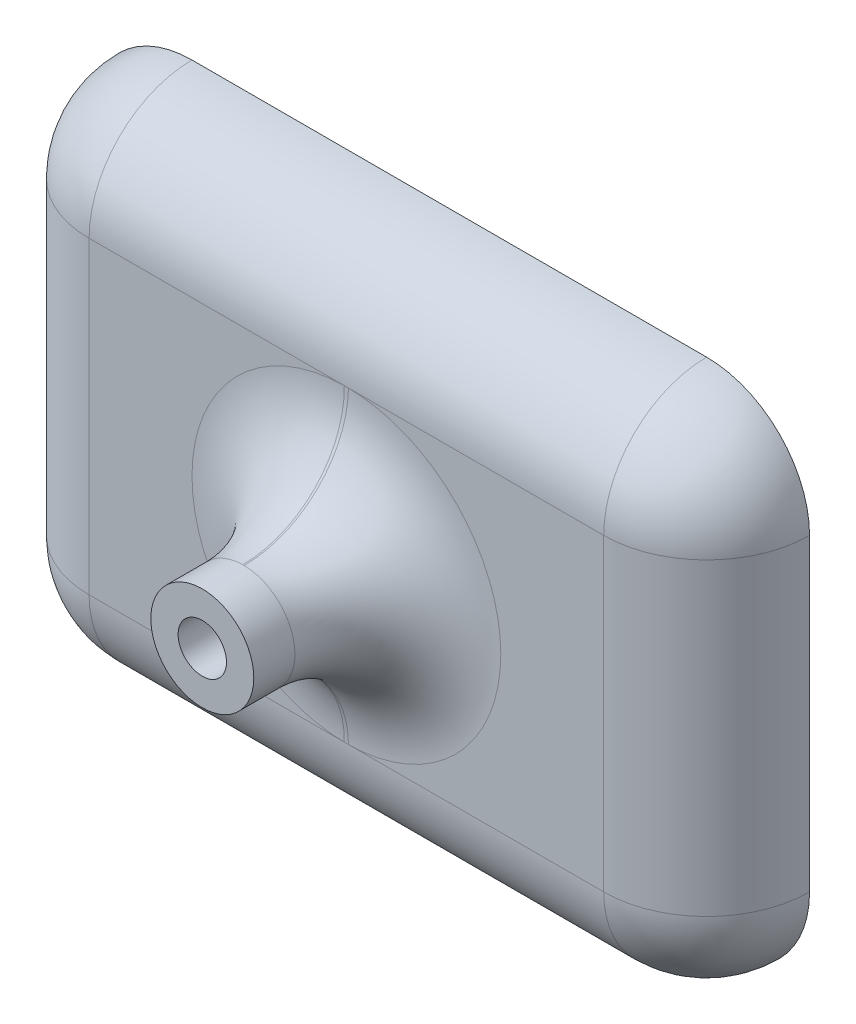
ISO-10303-21;
HEADER;
FILE_DESCRIPTION(('STEP AP214'),'2;1');
FILE_NAME('part.step','',(''),(''),'','','');
FILE_SCHEMA(('AUTOMOTIVE_DESIGN { 1 0 10303 214 1 1 1 1 }'));
ENDSEC;
DATA;
#1=APPLICATION_CONTEXT('core data for automotive mechanical design processes');
#2=APPLICATION_PROTOCOL_DEFINITION('international standard','automotive_design',2000,#1);
#3=PRODUCT_CONTEXT('',#1,'mechanical');
#4=PRODUCT('Part','Part','',(#3));
#5=PRODUCT_RELATED_PRODUCT_CATEGORY('part','',(#4));
#6=PRODUCT_DEFINITION_FORMATION('','',#4);
#7=PRODUCT_DEFINITION_CONTEXT('part definition',#1,'design');
#8=PRODUCT_DEFINITION('design','',#6,#7);
#9=PRODUCT_DEFINITION_SHAPE('','',#8);
#10=(LENGTH_UNIT() NAMED_UNIT(*) SI_UNIT(.MILLI.,.METRE.));
#11=(NAMED_UNIT(*) PLANE_ANGLE_UNIT() SI_UNIT($,.RADIAN.));
#12=(NAMED_UNIT(*) SI_UNIT($,.STERADIAN.) SOLID_ANGLE_UNIT());
#13=UNCERTAINTY_MEASURE_WITH_UNIT(LENGTH_MEASURE(1.E-05),#10,'distance_accuracy_value','');
#14=(GEOMETRIC_REPRESENTATION_CONTEXT(3) GLOBAL_UNCERTAINTY_ASSIGNED_CONTEXT((#13)) GLOBAL_UNIT_ASSIGNED_CONTEXT((#10,
#11,#12)) REPRESENTATION_CONTEXT('',''));
#15=CARTESIAN_POINT('',(0.,0.,0.));
#16=DIRECTION('',(0.,0.,1.));
#17=DIRECTION('',(1.,0.,0.));
#18=AXIS2_PLACEMENT_3D('',#15,#16,#17);
#19=CARTESIAN_POINT('',(0.,0.,10.));
#20=DIRECTION('',(0.,0.,1.));
#21=DIRECTION('',(1.,0.,0.));
#22=AXIS2_PLACEMENT_3D('',#19,#20,#21);
#23=PLANE('',#22);
#24=DIRECTION('',(-1.,0.,0.));
#25=VECTOR('',#24,1.);
#26=CARTESIAN_POINT('',(-35.8693815478202,40.,10.));
#27=LINE('',#26,#25);
#28=CARTESIAN_POINT('',(24.1306184521798,40.,10.));
#29=VERTEX_POINT('',#28);
#30=CARTESIAN_POINT('',(-0.66521685436907,40.,10.));
#31=VERTEX_POINT('',#30);
#32=EDGE_CURVE('E144',#29,#31,#27,.T.);
#33=ORIENTED_EDGE('',*,*,#32,.T.);
#34=CARTESIAN_POINT('',(-0.869381547820167,25.,10.));
#35=DIRECTION('',(0.,0.,1.));
#36=DIRECTION('',(1.,0.,0.));
#37=AXIS2_PLACEMENT_3D('',#34,#35,#36);
#38=CIRCLE('',#37,15.0013893763895);
#39=CARTESIAN_POINT('',(-0.665216854368468,10.,10.));
#40=VERTEX_POINT('',#39);
#41=EDGE_CURVE('E253',#31,#40,#38,.F.);
#42=ORIENTED_EDGE('',*,*,#41,.T.);
#43=DIRECTION('',(1.,0.,0.));
#44=VECTOR('',#43,1.);
#45=CARTESIAN_POINT('',(34.1306184521798,10.,10.));
#46=LINE('',#45,#44);
#47=CARTESIAN_POINT('',(24.1306184521798,10.,10.));
#48=VERTEX_POINT('',#47);
#49=EDGE_CURVE('E137',#40,#48,#46,.T.);
#50=ORIENTED_EDGE('',*,*,#49,.T.);
#51=DIRECTION('',(0.,1.,0.));
#52=VECTOR('',#51,1.);
#53=CARTESIAN_POINT('',(24.1306184521798,40.,10.));
#54=LINE('',#53,#52);
#55=EDGE_CURVE('E169',#48,#29,#54,.T.);
#56=ORIENTED_EDGE('',*,*,#55,.T.);
#57=EDGE_LOOP('',(#33,#42,#50,#56));
#58=FACE_BOUND('',#57,.T.);
#59=ADVANCED_FACE('F37',(#58),#23,.T.);
#60=CARTESIAN_POINT('',(-25.8693815478202,10.,10.));
#61=VERTEX_POINT('',#60);
#62=CARTESIAN_POINT('',(-1.07354624127186,10.,10.));
#63=VERTEX_POINT('',#62);
#64=EDGE_CURVE('E124',#61,#63,#46,.T.);
#65=ORIENTED_EDGE('',*,*,#64,.T.);
#66=CARTESIAN_POINT('',(-0.869381547820167,25.,10.));
#67=DIRECTION('',(0.,0.,1.));
#68=DIRECTION('',(1.,0.,0.));
#69=AXIS2_PLACEMENT_3D('',#66,#67,#68);
#70=CIRCLE('',#69,15.0013893763895);
#71=CARTESIAN_POINT('',(-1.07354624127127,40.,10.));
#72=VERTEX_POINT('',#71);
#73=EDGE_CURVE('E185',#63,#72,#70,.F.);
#74=ORIENTED_EDGE('',*,*,#73,.T.);
#75=CARTESIAN_POINT('',(-25.8693815478202,40.,10.));
#76=VERTEX_POINT('',#75);
#77=EDGE_CURVE('E149',#72,#76,#27,.T.);
#78=ORIENTED_EDGE('',*,*,#77,.T.);
#79=DIRECTION('',(0.,-1.,0.));
#80=VECTOR('',#79,1.);
#81=CARTESIAN_POINT('',(-25.8693815478202,10.,10.));
#82=LINE('',#81,#80);
#83=EDGE_CURVE('E129',#76,#61,#82,.T.);
#84=ORIENTED_EDGE('',*,*,#83,.T.);
#85=EDGE_LOOP('',(#65,#74,#78,#84));
#86=FACE_BOUND('',#85,.T.);
#87=ADVANCED_FACE('F316',(#86),#23,.T.);
#88=CARTESIAN_POINT('',(0.,0.,0.));
#89=DIRECTION('',(0.,0.,1.));
#90=DIRECTION('',(1.,0.,0.));
#91=AXIS2_PLACEMENT_3D('',#88,#89,#90);
#92=PLANE('',#91);
#93=CARTESIAN_POINT('',(-0.869381547820167,25.,0.));
#94=DIRECTION('',(0.,0.,1.));
#95=DIRECTION('',(1.,0.,0.));
#96=AXIS2_PLACEMENT_3D('',#93,#94,#95);
#97=CIRCLE('',#96,2.35);
#98=CARTESIAN_POINT('',(1.48061845217983,25.,0.));
#99=VERTEX_POINT('',#98);
#100=EDGE_CURVE('E283',#99,#99,#97,.T.);
#101=ORIENTED_EDGE('',*,*,#100,.T.);
#102=EDGE_LOOP('',(#101));
#103=FACE_BOUND('',#102,.T.);
#104=DIRECTION('',(0.,1.,0.));
#105=VECTOR('',#104,1.);
#106=CARTESIAN_POINT('',(34.1306184521798,50.,0.));
#107=LINE('',#106,#105);
#108=CARTESIAN_POINT('',(34.1306184521798,10.,0.));
#109=VERTEX_POINT('',#108);
#110=CARTESIAN_POINT('',(34.1306184521798,40.,0.));
#111=VERTEX_POINT('',#110);
#112=EDGE_CURVE('E286',#109,#111,#107,.T.);
#113=ORIENTED_EDGE('',*,*,#112,.F.);
#114=CARTESIAN_POINT('',(24.1306184521798,10.,0.));
#115=DIRECTION('',(0.,0.,1.));
#116=DIRECTION('',(1.,0.,0.));
#117=AXIS2_PLACEMENT_3D('',#114,#115,#116);
#118=CIRCLE('',#117,10.);
#119=CARTESIAN_POINT('',(24.1306184521798,0.,0.));
#120=VERTEX_POINT('',#119);
#121=EDGE_CURVE('E136',#109,#120,#118,.F.);
#122=ORIENTED_EDGE('',*,*,#121,.T.);
#123=DIRECTION('',(1.,0.,0.));
#124=VECTOR('',#123,1.);
#125=CARTESIAN_POINT('',(-35.8693815478202,0.,0.));
#126=LINE('',#125,#124);
#127=CARTESIAN_POINT('',(-25.8693815478202,0.,0.));
#128=VERTEX_POINT('',#127);
#129=EDGE_CURVE('E121',#128,#120,#126,.T.);
#130=ORIENTED_EDGE('',*,*,#129,.F.);
#131=CARTESIAN_POINT('',(-25.8693815478202,10.,0.));
#132=DIRECTION('',(0.,0.,1.));
#133=DIRECTION('',(1.,0.,0.));
#134=AXIS2_PLACEMENT_3D('',#131,#132,#133);
#135=CIRCLE('',#134,10.);
#136=CARTESIAN_POINT('',(-35.8693815478202,10.,0.));
#137=VERTEX_POINT('',#136);
#138=EDGE_CURVE('E134',#128,#137,#135,.F.);
#139=ORIENTED_EDGE('',*,*,#138,.T.);
#140=DIRECTION('',(0.,-1.,0.));
#141=VECTOR('',#140,1.);
#142=CARTESIAN_POINT('',(-35.8693815478202,50.,0.));
#143=LINE('',#142,#141);
#144=CARTESIAN_POINT('',(-35.8693815478202,40.,0.));
#145=VERTEX_POINT('',#144);
#146=EDGE_CURVE('E138',#145,#137,#143,.T.);
#147=ORIENTED_EDGE('',*,*,#146,.F.);
#148=CARTESIAN_POINT('',(-25.8693815478202,40.,0.));
#149=DIRECTION('',(0.,0.,1.));
#150=DIRECTION('',(1.,0.,0.));
#151=AXIS2_PLACEMENT_3D('',#148,#149,#150);
#152=CIRCLE('',#151,10.);
#153=CARTESIAN_POINT('',(-25.8693815478202,50.,0.));
#154=VERTEX_POINT('',#153);
#155=EDGE_CURVE('E143',#145,#154,#152,.F.);
#156=ORIENTED_EDGE('',*,*,#155,.T.);
#157=DIRECTION('',(-1.,0.,0.));
#158=VECTOR('',#157,1.);
#159=CARTESIAN_POINT('',(-35.8693815478202,50.,0.));
#160=LINE('',#159,#158);
#161=CARTESIAN_POINT('',(24.1306184521798,50.,0.));
#162=VERTEX_POINT('',#161);
#163=EDGE_CURVE('E293',#162,#154,#160,.T.);
#164=ORIENTED_EDGE('',*,*,#163,.F.);
#165=CARTESIAN_POINT('',(24.1306184521798,40.,0.));
#166=DIRECTION('',(0.,0.,1.));
#167=DIRECTION('',(1.,0.,0.));
#168=AXIS2_PLACEMENT_3D('',#165,#166,#167);
#169=CIRCLE('',#168,10.);
#170=EDGE_CURVE('E156',#162,#111,#169,.F.);
#171=ORIENTED_EDGE('',*,*,#170,.T.);
#172=EDGE_LOOP('',(#113,#122,#130,#139,#147,#156,#164,#171));
#173=FACE_BOUND('',#172,.T.);
#174=ADVANCED_FACE('F133',(#103,#173),#92,.F.);
#175=CARTESIAN_POINT('',(-0.869381547820167,25.,10.));
#176=DIRECTION('',(0.,0.,-1.));
#177=DIRECTION('',(-1.,0.,0.));
#178=AXIS2_PLACEMENT_3D('',#175,#176,#177);
#179=CYLINDRICAL_SURFACE('',#178,2.35);
#180=ORIENTED_EDGE('',*,*,#100,.F.);
#181=EDGE_LOOP('',(#180));
#182=FACE_BOUND('',#181,.T.);
#183=CARTESIAN_POINT('',(-0.869381547820167,25.,24.));
#184=DIRECTION('',(0.,0.,1.));
#185=DIRECTION('',(1.,0.,0.));
#186=AXIS2_PLACEMENT_3D('',#183,#184,#185);
#187=CIRCLE('',#186,2.35);
#188=CARTESIAN_POINT('',(1.48061845217983,25.,24.));
#189=VERTEX_POINT('',#188);
#190=EDGE_CURVE('E162',#189,#189,#187,.T.);
#191=ORIENTED_EDGE('',*,*,#190,.T.);
#192=EDGE_LOOP('',(#191));
#193=FACE_BOUND('',#192,.T.);
#194=ADVANCED_FACE('F330',(#182,#193),#179,.F.);
#195=CARTESIAN_POINT('',(-0.869381547820167,25.,24.));
#196=DIRECTION('',(0.,0.,1.));
#197=DIRECTION('',(1.,0.,0.));
#198=AXIS2_PLACEMENT_3D('',#195,#196,#197);
#199=PLANE('',#198);
#200=CARTESIAN_POINT('',(-0.869381547820167,25.,24.));
#201=DIRECTION('',(0.,0.,1.));
#202=DIRECTION('',(1.,0.,0.));
#203=AXIS2_PLACEMENT_3D('',#200,#201,#202);
#204=CIRCLE('',#203,5.00138937638951);
#205=CARTESIAN_POINT('',(4.13200782856934,25.,24.));
#206=VERTEX_POINT('',#205);
#207=EDGE_CURVE('E281',#206,#206,#204,.T.);
#208=ORIENTED_EDGE('',*,*,#207,.T.);
#209=EDGE_LOOP('',(#208));
#210=FACE_BOUND('',#209,.T.);
#211=ORIENTED_EDGE('',*,*,#190,.F.);
#212=EDGE_LOOP('',(#211));
#213=FACE_BOUND('',#212,.T.);
#214=ADVANCED_FACE('F278',(#210,#213),#199,.T.);
#215=CARTESIAN_POINT('',(-0.869381547820167,25.,24.));
#216=DIRECTION('',(0.,0.,-1.));
#217=DIRECTION('',(-1.,0.,0.));
#218=AXIS2_PLACEMENT_3D('',#215,#216,#217);
#219=CYLINDRICAL_SURFACE('',#218,5.00138937638951);
#220=CARTESIAN_POINT('',(-2.29802944846544,39.9666031165121,9.99994423225316));
#221=CARTESIAN_POINT('',(-1.34250908953898,29.9789613582458,9.96658843542345));
#222=CARTESIAN_POINT('',(-1.34568572562747,29.978657452011,19.9998884645063));
#223=CARTESIAN_POINT('',(-2.09449489100395,39.9763407729258,9.99997398500944));
#224=CARTESIAN_POINT('',(-1.27606424864487,29.9852923140613,9.9763326206887));
#225=CARTESIAN_POINT('',(-1.27782830603284,29.9851504254439,19.9999479700195));
#226=CARTESIAN_POINT('',(-1.89054767467077,39.9839952685162,9.99998800871272));
#227=CARTESIAN_POINT('',(-1.20883959552267,29.9903207599955,9.9839920376068));
#228=CARTESIAN_POINT('',(-1.20983330800164,29.9902543677477,19.9999760174261));
#229=CARTESIAN_POINT('',(-1.48226317402795,39.9951287116274,10.0000010958449));
#230=CARTESIAN_POINT('',(-1.07360806569829,29.9976715934303,9.99512720233603));
#231=CARTESIAN_POINT('',(-1.07371326519591,29.9976780380095,20.0000021916902));
#232=CARTESIAN_POINT('',(-1.27792603511335,39.9986089920484,10.0000001640508));
#233=CARTESIAN_POINT('',(-1.00557392058011,29.9999978661693,9.99860890943502));
#234=CARTESIAN_POINT('',(-1.00558826889539,29.9999986547321,20.0000003281017));
#235=CARTESIAN_POINT('',(-1.00549449613915,40.0004631598693,9.99999994537648));
#236=CARTESIAN_POINT('',(-0.914767815546748,30.0012352294873,10.0004631444294));
#237=CARTESIAN_POINT('',(-0.914760934797686,30.0012349955814,19.9999998907529));
#238=CARTESIAN_POINT('',(-0.93743802197966,40.0006946881948,9.99999997587041));
#239=CARTESIAN_POINT('',(-0.892074419087346,30.0013893763895,10.0006946158077));
#240=CARTESIAN_POINT('',(-0.892071241308927,30.0013893763895,19.9999999517408));
#241=CARTESIAN_POINT('',(-0.801325073660677,40.0006946881948,9.99999997587041));
#242=CARTESIAN_POINT('',(-0.846688676552989,30.0013893763895,10.0006946158077));
#243=CARTESIAN_POINT('',(-0.846691854331408,30.0013893763895,19.9999999517408));
#244=CARTESIAN_POINT('',(-0.733268599501185,40.0004631598693,9.99999994537648));
#245=CARTESIAN_POINT('',(-0.823995280093586,30.0012352294873,10.0004631444294));
#246=CARTESIAN_POINT('',(-0.824002160842648,30.0012349955814,19.9999998907529));
#247=CARTESIAN_POINT('',(-0.460837060526984,39.9986089920484,10.0000001640508));
#248=CARTESIAN_POINT('',(-0.733189175060224,29.9999978661693,9.99860890943501));
#249=CARTESIAN_POINT('',(-0.733174826744949,29.9999986547321,20.0000003281017));
#250=CARTESIAN_POINT('',(-0.256499921612389,39.9951287116274,10.0000010958449));
#251=CARTESIAN_POINT('',(-0.665155029942042,29.9976715934303,9.99512720233603));
#252=CARTESIAN_POINT('',(-0.665049830444423,29.9976780380095,20.0000021916902));
#253=CARTESIAN_POINT('',(0.151784579030429,39.9839952685162,9.99998800871272));
#254=CARTESIAN_POINT('',(-0.529923500117668,29.9903207599955,9.9839920376068));
#255=CARTESIAN_POINT('',(-0.528929787638698,29.9902543677477,19.9999760174261));
#256=CARTESIAN_POINT('',(0.355731795363612,39.9763407729258,9.99997398500944));
#257=CARTESIAN_POINT('',(-0.462698846995462,29.9852923140613,9.97633262068869));
#258=CARTESIAN_POINT('',(-0.46093478960749,29.9851504254439,19.9999479700195));
#259=CARTESIAN_POINT('',(0.559266352825104,39.9666031165121,9.99994423225316));
#260=CARTESIAN_POINT('',(-0.39625400610135,29.9789613582458,9.96658843542345));
#261=CARTESIAN_POINT('',(-0.393077370012862,29.978657452011,19.9998884645063));
#262=(BOUNDED_SURFACE() B_SPLINE_SURFACE(3,2,((#220,#221,#222),(#223,#224,#225),(#226,#227,
#228),(#229,#230,#231),(#232,#233,#234),(#235,#236,#237),(#238,#239,#240),(#241,#242,#243),
(#244,#245,#246),(#247,#248,#249),(#250,#251,#252),(#253,#254,#255),(#256,#257,#258),(#259,#260,
#261)),.UNSPECIFIED.,.F.,.F.,.F.) B_SPLINE_SURFACE_WITH_KNOTS((4,2,2,2,2,2,4),(3,3),(0.,
0.613377899280594,1.22655988403984,1.43072930491069,1.63489872578153,2.24808071054077,
2.86145860982137),(0.,1.),
.UNSPECIFIED.) GEOMETRIC_REPRESENTATION_ITEM() RATIONAL_B_SPLINE_SURFACE(((1.,0.705930411209866,
1.),(1.,0.706272374076344,1.),(1.,0.70654190030469,1.),(1.,0.706934486668493,1.),(1.,
0.707057593558109,1.),(1.,0.707123159048034,1.),(1.,0.707131341696673,1.),(1.,0.707131341696673,
1.),(1.,0.707123159048034,1.),(1.,0.707057593558109,1.),(1.,0.706934486668493,1.),(1.,
0.70654190030469,1.),(1.,0.706272374076344,1.),(1.,0.705930411209866,1.))) REPRESENTATION_ITEM('') SURFACE());
#263=CARTESIAN_POINT('',(-0.393077370012862,29.978657452011,19.9998884645063));
#264=CARTESIAN_POINT('',(-0.46093478960749,29.9851504254439,19.9999479700195));
#265=CARTESIAN_POINT('',(-0.528929787638698,29.9902543677477,19.9999760174261));
#266=CARTESIAN_POINT('',(-0.665049830444423,29.9976780380095,20.0000021916903));
#267=CARTESIAN_POINT('',(-0.733174826744949,29.9999986547321,20.0000003281017));
#268=CARTESIAN_POINT('',(-0.824002160842648,30.0012349955814,19.9999998907529));
#269=CARTESIAN_POINT('',(-0.846691854331408,30.0013893763895,19.9999999517408));
#270=CARTESIAN_POINT('',(-0.892071241308927,30.0013893763895,19.9999999517408));
#271=CARTESIAN_POINT('',(-0.914760934797686,30.0012349955814,19.9999998907529));
#272=CARTESIAN_POINT('',(-1.00558826889539,29.9999986547321,20.0000003281017));
#273=CARTESIAN_POINT('',(-1.07371326519591,29.9976780380095,20.0000021916903));
#274=CARTESIAN_POINT('',(-1.20983330800164,29.9902543677477,19.9999760174261));
#275=CARTESIAN_POINT('',(-1.27782830603284,29.9851504254439,19.9999479700195));
#276=CARTESIAN_POINT('',(-1.34568572562747,29.978657452011,19.9998884645063));
#277=B_SPLINE_CURVE_WITH_KNOTS('',3,(#263,#264,#265,#266,#267,#268,#269,#270,#271,#272,#273,
#274,#275,#276),.UNSPECIFIED.,.F.,.F.,(4,2,2,2,2,2,4),(0.,0.613377899280597,1.22655988403984,
1.43072930491069,1.63489872578153,2.24808071054078,2.86145860982137),.UNSPECIFIED.);
#278=CARTESIAN_POINT('',(-0.801314043988339,30.0009261651402,20.));
#279=VERTEX_POINT('',#278);
#280=CARTESIAN_POINT('',(-0.937449051651996,30.0009261651402,20.));
#281=VERTEX_POINT('',#280);
#282=EDGE_CURVE('E252',#279,#281,#277,.T.);
#283=ORIENTED_EDGE('',*,*,#282,.T.);
#284=CARTESIAN_POINT('',(-0.869381547820167,25.,20.));
#285=DIRECTION('',(0.,0.,1.));
#286=DIRECTION('',(1.,0.,0.));
#287=AXIS2_PLACEMENT_3D('',#284,#285,#286);
#288=CIRCLE('',#287,5.00138937638951);
#289=CARTESIAN_POINT('',(-0.937449051652194,19.9990738348598,20.));
#290=VERTEX_POINT('',#289);
#291=EDGE_CURVE('E11',#281,#290,#288,.T.);
#292=ORIENTED_EDGE('',*,*,#291,.T.);
#293=CARTESIAN_POINT('',(0.559266352829282,10.0333968834881,9.99994423225316));
#294=CARTESIAN_POINT('',(-0.396254006099985,20.0210386417543,9.96658843542325));
#295=CARTESIAN_POINT('',(-0.393077370011469,20.0213425479891,19.9998884645063));
#296=CARTESIAN_POINT('',(0.355731795367199,10.0236592270744,9.99997398500944));
#297=CARTESIAN_POINT('',(-0.462698846994282,20.0147076859388,9.97633262068856));
#298=CARTESIAN_POINT('',(-0.460934789606294,20.0148495745562,19.9999479700195));
#299=CARTESIAN_POINT('',(0.15178457903342,10.0160047314839,9.99998800871272));
#300=CARTESIAN_POINT('',(-0.52992350011668,20.0096792400046,9.98399203760671));
#301=CARTESIAN_POINT('',(-0.528929787637701,20.0097456322523,19.9999760174261));
#302=CARTESIAN_POINT('',(-0.256499921610592,10.0048712883726,10.0000010958449));
#303=CARTESIAN_POINT('',(-0.665155029941444,20.0023284065697,9.995127202336));
#304=CARTESIAN_POINT('',(-0.665049830443824,20.0023219619905,20.0000021916902));
#305=CARTESIAN_POINT('',(-0.460837060525786,10.0013910079516,10.0000001640508));
#306=CARTESIAN_POINT('',(-0.733189175059824,20.0000021338307,9.998608909435));
#307=CARTESIAN_POINT('',(-0.733174826744549,20.0000013452679,20.0000003281017));
#308=CARTESIAN_POINT('',(-0.733268599500785,9.99953684013072,9.99999994537648));
#309=CARTESIAN_POINT('',(-0.823995280093453,19.9987647705127,10.0004631444294));
#310=CARTESIAN_POINT('',(-0.824002160842515,19.9987650044186,19.9999998907529));
#311=CARTESIAN_POINT('',(-0.801325073660476,9.99930531180524,9.99999997587041));
#312=CARTESIAN_POINT('',(-0.846688676552922,19.9986106236105,10.0006946158077));
#313=CARTESIAN_POINT('',(-0.846691854331341,19.9986106236105,19.9999999517408));
#314=CARTESIAN_POINT('',(-0.937438021979857,9.99930531180524,9.99999997587041));
#315=CARTESIAN_POINT('',(-0.892074419087411,19.9986106236105,10.0006946158077));
#316=CARTESIAN_POINT('',(-0.892071241308992,19.9986106236105,19.9999999517408));
#317=CARTESIAN_POINT('',(-1.00549449613955,9.99953684013072,9.99999994537648));
#318=CARTESIAN_POINT('',(-0.91476781554688,19.9987647705127,10.0004631444294));
#319=CARTESIAN_POINT('',(-0.914760934797818,19.9987650044186,19.9999998907529));
#320=CARTESIAN_POINT('',(-1.27792603511455,10.0013910079516,10.0000001640508));
#321=CARTESIAN_POINT('',(-1.00557392058051,20.0000021338307,9.998608909435));
#322=CARTESIAN_POINT('',(-1.00558826889578,20.0000013452679,20.0000003281017));
#323=CARTESIAN_POINT('',(-1.48226317402974,10.0048712883726,10.0000010958449));
#324=CARTESIAN_POINT('',(-1.07360806569889,20.0023284065697,9.995127202336));
#325=CARTESIAN_POINT('',(-1.07371326519651,20.0023219619905,20.0000021916902));
#326=CARTESIAN_POINT('',(-1.89054767467375,10.0160047314839,9.99998800871272));
#327=CARTESIAN_POINT('',(-1.20883959552365,20.0096792400046,9.98399203760671));
#328=CARTESIAN_POINT('',(-1.20983330800263,20.0097456322523,19.9999760174261));
#329=CARTESIAN_POINT('',(-2.09449489100753,10.0236592270744,9.99997398500944));
#330=CARTESIAN_POINT('',(-1.27606424864605,20.0147076859388,9.97633262068856));
#331=CARTESIAN_POINT('',(-1.27782830603404,20.0148495745562,19.9999479700195));
#332=CARTESIAN_POINT('',(-2.29802944846962,10.0333968834881,9.99994423225316));
#333=CARTESIAN_POINT('',(-1.34250908954035,20.0210386417543,9.96658843542325));
#334=CARTESIAN_POINT('',(-1.34568572562886,20.0213425479891,19.9998884645063));
#335=(BOUNDED_SURFACE() B_SPLINE_SURFACE(3,2,((#293,#294,#295),(#296,#297,#298),(#299,#300,
#301),(#302,#303,#304),(#305,#306,#307),(#308,#309,#310),(#311,#312,#313),(#314,#315,#316),
(#317,#318,#319),(#320,#321,#322),(#323,#324,#325),(#326,#327,#328),(#329,#330,#331),(#332,#333,
#334)),.UNSPECIFIED.,.F.,.F.,.F.) B_SPLINE_SURFACE_WITH_KNOTS((4,2,2,2,2,2,4),(3,3),(0.,
0.613377899282395,1.22655988404344,1.43072930491488,1.63489872578632,2.24808071054736,
2.86145860982976),(0.,1.),
.UNSPECIFIED.) GEOMETRIC_REPRESENTATION_ITEM() RATIONAL_B_SPLINE_SURFACE(((1.,0.705930411209859,
1.),(1.,0.706272374076339,1.),(1.,0.706541900304687,1.),(1.,0.706934486668492,1.),(1.,
0.707057593558108,1.),(1.,0.707123159048034,1.),(1.,0.707131341696674,1.),(1.,0.707131341696674,
1.),(1.,0.707123159048034,1.),(1.,0.707057593558108,1.),(1.,0.706934486668492,1.),(1.,
0.706541900304687,1.),(1.,0.706272374076339,1.),(1.,0.705930411209859,1.))) REPRESENTATION_ITEM('') SURFACE());
#336=CARTESIAN_POINT('',(-1.34568572562886,20.0213425479891,19.9998884645063));
#337=CARTESIAN_POINT('',(-1.27782830603404,20.0148495745562,19.9999479700195));
#338=CARTESIAN_POINT('',(-1.20983330800263,20.0097456322523,19.9999760174261));
#339=CARTESIAN_POINT('',(-1.07371326519651,20.0023219619905,20.0000021916903));
#340=CARTESIAN_POINT('',(-1.00558826889578,20.0000013452679,20.0000003281017));
#341=CARTESIAN_POINT('',(-0.914760934797818,19.9987650044186,19.9999998907529));
#342=CARTESIAN_POINT('',(-0.892071241308992,19.9986106236105,19.9999999517408));
#343=CARTESIAN_POINT('',(-0.846691854331341,19.9986106236105,19.9999999517408));
#344=CARTESIAN_POINT('',(-0.824002160842515,19.9987650044186,19.9999998907529));
#345=CARTESIAN_POINT('',(-0.733174826744549,20.0000013452679,20.0000003281017));
#346=CARTESIAN_POINT('',(-0.665049830443823,20.0023219619905,20.0000021916903));
#347=CARTESIAN_POINT('',(-0.528929787637701,20.0097456322523,19.9999760174261));
#348=CARTESIAN_POINT('',(-0.460934789606294,20.0148495745562,19.9999479700195));
#349=CARTESIAN_POINT('',(-0.393077370011469,20.0213425479891,19.9998884645063));
#350=B_SPLINE_CURVE_WITH_KNOTS('',3,(#336,#337,#338,#339,#340,#341,#342,#343,#344,#345,#346,
#347,#348,#349),.UNSPECIFIED.,.F.,.F.,(4,2,2,2,2,2,4),(0.,0.613377899282395,1.22655988404344,
1.43072930491488,1.63489872578632,2.24808071054736,2.86145860982976),.UNSPECIFIED.);
#351=CARTESIAN_POINT('',(-0.801314043988139,19.9990738348598,20.));
#352=VERTEX_POINT('',#351);
#353=EDGE_CURVE('E49',#290,#352,#350,.T.);
#354=ORIENTED_EDGE('',*,*,#353,.T.);
#355=CARTESIAN_POINT('',(-0.869381547820167,25.,20.));
#356=DIRECTION('',(0.,0.,1.));
#357=DIRECTION('',(1.,0.,0.));
#358=AXIS2_PLACEMENT_3D('',#355,#356,#357);
#359=CIRCLE('',#358,5.00138937638951);
#360=EDGE_CURVE('E258',#352,#279,#359,.T.);
#361=ORIENTED_EDGE('',*,*,#360,.T.);
#362=EDGE_LOOP('',(#283,#292,#354,#361));
#363=FACE_BOUND('',#362,.T.);
#364=ORIENTED_EDGE('',*,*,#207,.F.);
#365=EDGE_LOOP('',(#364));
#366=FACE_BOUND('',#365,.T.);
#367=ADVANCED_FACE('F213',(#363,#366),#219,.T.);
#368=CARTESIAN_POINT('',(0.,10.,0.));
#369=DIRECTION('',(-1.,0.,0.));
#370=DIRECTION('',(0.,0.,1.));
#371=AXIS2_PLACEMENT_3D('',#368,#369,#370);
#372=CYLINDRICAL_SURFACE('',#371,10.);
#373=ORIENTED_EDGE('',*,*,#49,.F.);
#374=CARTESIAN_POINT('',(0.559266352829282,10.0333968834881,9.99994423225316));
#375=CARTESIAN_POINT('',(0.355731795367199,10.0236592270744,9.99997398500944));
#376=CARTESIAN_POINT('',(0.15178457903342,10.0160047314839,9.99998800871272));
#377=CARTESIAN_POINT('',(-0.256499921610592,10.0048712883726,10.0000010958449));
#378=CARTESIAN_POINT('',(-0.460837060525786,10.0013910079516,10.0000001640508));
#379=CARTESIAN_POINT('',(-0.733268599500785,9.99953684013072,9.99999994537648));
#380=CARTESIAN_POINT('',(-0.801325073660476,9.99930531180524,9.99999997587041));
#381=CARTESIAN_POINT('',(-0.937438021979857,9.99930531180524,9.99999997587041));
#382=CARTESIAN_POINT('',(-1.00549449613955,9.99953684013072,9.99999994537648));
#383=CARTESIAN_POINT('',(-1.27792603511455,10.0013910079516,10.0000001640508));
#384=CARTESIAN_POINT('',(-1.48226317402974,10.0048712883726,10.0000010958449));
#385=CARTESIAN_POINT('',(-1.89054767467375,10.0160047314839,9.99998800871272));
#386=CARTESIAN_POINT('',(-2.09449489100753,10.0236592270744,9.99997398500944));
#387=CARTESIAN_POINT('',(-2.29802944846962,10.0333968834881,9.99994423225316));
#388=B_SPLINE_CURVE_WITH_KNOTS('',3,(#374,#375,#376,#377,#378,#379,#380,#381,#382,#383,#384,
#385,#386,#387),.UNSPECIFIED.,.F.,.F.,(4,2,2,2,2,2,4),(0.,0.613377899282395,1.22655988404344,
1.43072930491488,1.63489872578632,2.24808071054736,2.86145860982976),.UNSPECIFIED.);
#389=EDGE_CURVE('E247',#40,#63,#388,.T.);
#390=ORIENTED_EDGE('',*,*,#389,.T.);
#391=ORIENTED_EDGE('',*,*,#64,.F.);
#392=CARTESIAN_POINT('',(-25.8693815478202,10.,0.));
#393=DIRECTION('',(-1.,0.,0.));
#394=DIRECTION('',(0.,0.,1.));
#395=AXIS2_PLACEMENT_3D('',#392,#393,#394);
#396=CIRCLE('',#395,10.);
#397=EDGE_CURVE('E116',#61,#128,#396,.F.);
#398=ORIENTED_EDGE('',*,*,#397,.T.);
#399=ORIENTED_EDGE('',*,*,#129,.T.);
#400=CARTESIAN_POINT('',(24.1306184521798,10.,0.));
#401=DIRECTION('',(-1.,0.,0.));
#402=DIRECTION('',(0.,0.,1.));
#403=AXIS2_PLACEMENT_3D('',#400,#401,#402);
#404=CIRCLE('',#403,10.);
#405=EDGE_CURVE('E165',#120,#48,#404,.T.);
#406=ORIENTED_EDGE('',*,*,#405,.T.);
#407=EDGE_LOOP('',(#373,#390,#391,#398,#399,#406));
#408=FACE_BOUND('',#407,.T.);
#409=ADVANCED_FACE('F119',(#408),#372,.T.);
#410=CARTESIAN_POINT('',(0.,40.,0.));
#411=DIRECTION('',(1.,0.,0.));
#412=DIRECTION('',(0.,1.,0.));
#413=AXIS2_PLACEMENT_3D('',#410,#411,#412);
#414=CYLINDRICAL_SURFACE('',#413,10.);
#415=ORIENTED_EDGE('',*,*,#77,.F.);
#416=CARTESIAN_POINT('',(-2.29802944846544,39.9666031165121,9.99994423225316));
#417=CARTESIAN_POINT('',(-2.09449489100395,39.9763407729258,9.99997398500944));
#418=CARTESIAN_POINT('',(-1.89054767467077,39.9839952685162,9.99998800871272));
#419=CARTESIAN_POINT('',(-1.48226317402795,39.9951287116274,10.0000010958449));
#420=CARTESIAN_POINT('',(-1.27792603511335,39.9986089920484,10.0000001640508));
#421=CARTESIAN_POINT('',(-1.00549449613915,40.0004631598693,9.99999994537648));
#422=CARTESIAN_POINT('',(-0.93743802197966,40.0006946881948,9.99999997587041));
#423=CARTESIAN_POINT('',(-0.801325073660677,40.0006946881948,9.99999997587041));
#424=CARTESIAN_POINT('',(-0.733268599501185,40.0004631598693,9.99999994537648));
#425=CARTESIAN_POINT('',(-0.460837060526984,39.9986089920484,10.0000001640508));
#426=CARTESIAN_POINT('',(-0.256499921612389,39.9951287116274,10.0000010958449));
#427=CARTESIAN_POINT('',(0.151784579030429,39.9839952685162,9.99998800871272));
#428=CARTESIAN_POINT('',(0.355731795363612,39.9763407729258,9.99997398500944));
#429=CARTESIAN_POINT('',(0.559266352825104,39.9666031165121,9.99994423225316));
#430=B_SPLINE_CURVE_WITH_KNOTS('',3,(#416,#417,#418,#419,#420,#421,#422,#423,#424,#425,#426,
#427,#428,#429),.UNSPECIFIED.,.F.,.F.,(4,2,2,2,2,2,4),(0.,0.613377899280594,1.22655988403984,
1.43072930491069,1.63489872578153,2.24808071054077,2.86145860982137),.UNSPECIFIED.);
#431=EDGE_CURVE('E171',#72,#31,#430,.T.);
#432=ORIENTED_EDGE('',*,*,#431,.T.);
#433=ORIENTED_EDGE('',*,*,#32,.F.);
#434=CARTESIAN_POINT('',(24.1306184521798,40.,0.));
#435=DIRECTION('',(1.,0.,0.));
#436=DIRECTION('',(0.,1.,0.));
#437=AXIS2_PLACEMENT_3D('',#434,#435,#436);
#438=CIRCLE('',#437,10.);
#439=EDGE_CURVE('E167',#29,#162,#438,.F.);
#440=ORIENTED_EDGE('',*,*,#439,.T.);
#441=ORIENTED_EDGE('',*,*,#163,.T.);
#442=CARTESIAN_POINT('',(-25.8693815478202,40.,0.));
#443=DIRECTION('',(1.,0.,0.));
#444=DIRECTION('',(0.,1.,0.));
#445=AXIS2_PLACEMENT_3D('',#442,#443,#444);
#446=CIRCLE('',#445,10.);
#447=EDGE_CURVE('E130',#154,#76,#446,.T.);
#448=ORIENTED_EDGE('',*,*,#447,.T.);
#449=EDGE_LOOP('',(#415,#432,#433,#440,#441,#448));
#450=FACE_BOUND('',#449,.T.);
#451=ADVANCED_FACE('F187',(#450),#414,.T.);
#452=CARTESIAN_POINT('',(-25.8693815478202,10.,0.));
#453=DIRECTION('',(0.,0.,1.));
#454=DIRECTION('',(1.,0.,0.));
#455=AXIS2_PLACEMENT_3D('',#452,#453,#454);
#456=SPHERICAL_SURFACE('',#455,10.);
#457=ORIENTED_EDGE('',*,*,#138,.F.);
#458=ORIENTED_EDGE('',*,*,#397,.F.);
#459=CARTESIAN_POINT('',(-25.8693815478202,10.,0.));
#460=DIRECTION('',(0.,1.,0.));
#461=DIRECTION('',(-1.,0.,0.));
#462=AXIS2_PLACEMENT_3D('',#459,#460,#461);
#463=CIRCLE('',#462,10.);
#464=EDGE_CURVE('E141',#137,#61,#463,.T.);
#465=ORIENTED_EDGE('',*,*,#464,.F.);
#466=EDGE_LOOP('',(#457,#458,#465));
#467=FACE_BOUND('',#466,.T.);
#468=ADVANCED_FACE('F140',(#467),#456,.T.);
#469=CARTESIAN_POINT('',(-25.8693815478202,0.,0.));
#470=DIRECTION('',(0.,1.,0.));
#471=DIRECTION('',(-1.,0.,0.));
#472=AXIS2_PLACEMENT_3D('',#469,#470,#471);
#473=CYLINDRICAL_SURFACE('',#472,10.);
#474=ORIENTED_EDGE('',*,*,#464,.T.);
#475=ORIENTED_EDGE('',*,*,#83,.F.);
#476=CARTESIAN_POINT('',(-25.8693815478202,40.,0.));
#477=DIRECTION('',(0.,1.,0.));
#478=DIRECTION('',(0.,0.,1.));
#479=AXIS2_PLACEMENT_3D('',#476,#477,#478);
#480=CIRCLE('',#479,10.);
#481=EDGE_CURVE('E157',#145,#76,#480,.T.);
#482=ORIENTED_EDGE('',*,*,#481,.F.);
#483=ORIENTED_EDGE('',*,*,#146,.T.);
#484=EDGE_LOOP('',(#474,#475,#482,#483));
#485=FACE_BOUND('',#484,.T.);
#486=ADVANCED_FACE('F318',(#485),#473,.T.);
#487=CARTESIAN_POINT('',(-25.8693815478202,40.,0.));
#488=DIRECTION('',(0.,0.,1.));
#489=DIRECTION('',(1.,0.,0.));
#490=AXIS2_PLACEMENT_3D('',#487,#488,#489);
#491=SPHERICAL_SURFACE('',#490,10.);
#492=ORIENTED_EDGE('',*,*,#481,.T.);
#493=ORIENTED_EDGE('',*,*,#447,.F.);
#494=ORIENTED_EDGE('',*,*,#155,.F.);
#495=EDGE_LOOP('',(#492,#493,#494));
#496=FACE_BOUND('',#495,.T.);
#497=ADVANCED_FACE('F314',(#496),#491,.T.);
#498=CARTESIAN_POINT('',(24.1306184521798,40.,0.));
#499=DIRECTION('',(0.,0.,1.));
#500=DIRECTION('',(1.,0.,0.));
#501=AXIS2_PLACEMENT_3D('',#498,#499,#500);
#502=SPHERICAL_SURFACE('',#501,10.);
#503=ORIENTED_EDGE('',*,*,#170,.F.);
#504=ORIENTED_EDGE('',*,*,#439,.F.);
#505=CARTESIAN_POINT('',(24.1306184521798,40.,0.));
#506=DIRECTION('',(0.,-1.,0.));
#507=DIRECTION('',(0.,0.,-1.));
#508=AXIS2_PLACEMENT_3D('',#505,#506,#507);
#509=CIRCLE('',#508,10.);
#510=EDGE_CURVE('E160',#111,#29,#509,.T.);
#511=ORIENTED_EDGE('',*,*,#510,.F.);
#512=EDGE_LOOP('',(#503,#504,#511));
#513=FACE_BOUND('',#512,.T.);
#514=ADVANCED_FACE('F195',(#513),#502,.T.);
#515=CARTESIAN_POINT('',(24.1306184521798,0.,0.));
#516=DIRECTION('',(0.,-1.,0.));
#517=DIRECTION('',(0.,0.,-1.));
#518=AXIS2_PLACEMENT_3D('',#515,#516,#517);
#519=CYLINDRICAL_SURFACE('',#518,10.);
#520=ORIENTED_EDGE('',*,*,#510,.T.);
#521=ORIENTED_EDGE('',*,*,#55,.F.);
#522=CARTESIAN_POINT('',(24.1306184521798,10.,0.));
#523=DIRECTION('',(0.,-1.,0.));
#524=DIRECTION('',(0.,0.,-1.));
#525=AXIS2_PLACEMENT_3D('',#522,#523,#524);
#526=CIRCLE('',#525,10.);
#527=EDGE_CURVE('E172',#109,#48,#526,.T.);
#528=ORIENTED_EDGE('',*,*,#527,.F.);
#529=ORIENTED_EDGE('',*,*,#112,.T.);
#530=EDGE_LOOP('',(#520,#521,#528,#529));
#531=FACE_BOUND('',#530,.T.);
#532=ADVANCED_FACE('F302',(#531),#519,.T.);
#533=CARTESIAN_POINT('',(24.1306184521798,10.,0.));
#534=DIRECTION('',(0.,0.,1.));
#535=DIRECTION('',(1.,0.,0.));
#536=AXIS2_PLACEMENT_3D('',#533,#534,#535);
#537=SPHERICAL_SURFACE('',#536,10.);
#538=ORIENTED_EDGE('',*,*,#527,.T.);
#539=ORIENTED_EDGE('',*,*,#405,.F.);
#540=ORIENTED_EDGE('',*,*,#121,.F.);
#541=EDGE_LOOP('',(#538,#539,#540));
#542=FACE_BOUND('',#541,.T.);
#543=ADVANCED_FACE('F237',(#542),#537,.T.);
#544=CARTESIAN_POINT('',(-0.665216854368471,10.,20.));
#545=DIRECTION('',(-0.999907383485979,-0.0136097189619668,0.));
#546=DIRECTION('',(0.0136097189619668,-0.999907383485979,0.));
#547=AXIS2_PLACEMENT_3D('',#544,#545,#546);
#548=CIRCLE('',#547,10.);
#549=EDGE_CURVE('E225',#352,#40,#548,.T.);
#550=ORIENTED_EDGE('',*,*,#549,.F.);
#551=ORIENTED_EDGE('',*,*,#353,.F.);
#552=CARTESIAN_POINT('',(-1.07354624127186,10.,20.));
#553=DIRECTION('',(0.999907383485979,-0.0136097189619668,0.));
#554=DIRECTION('',(0.0136097189619668,0.999907383485979,0.));
#555=AXIS2_PLACEMENT_3D('',#552,#553,#554);
#556=CIRCLE('',#555,10.);
#557=EDGE_CURVE('E175',#63,#290,#556,.T.);
#558=ORIENTED_EDGE('',*,*,#557,.F.);
#559=ORIENTED_EDGE('',*,*,#389,.F.);
#560=EDGE_LOOP('',(#550,#551,#558,#559));
#561=FACE_BOUND('',#560,.T.);
#562=ADVANCED_FACE('F233',(#561),#335,.F.);
#563=CARTESIAN_POINT('',(-0.869381547820167,25.,20.));
#564=DIRECTION('',(0.,0.,1.));
#565=DIRECTION('',(1.,0.,0.));
#566=AXIS2_PLACEMENT_3D('',#563,#564,#565);
#567=TOROIDAL_SURFACE('',#566,15.0013893763895,10.);
#568=ORIENTED_EDGE('',*,*,#557,.T.);
#569=ORIENTED_EDGE('',*,*,#291,.F.);
#570=CARTESIAN_POINT('',(-1.07354624127127,40.,20.));
#571=DIRECTION('',(-0.999907383485979,-0.0136097189619271,0.));
#572=DIRECTION('',(0.0136097189619271,-0.999907383485979,0.));
#573=AXIS2_PLACEMENT_3D('',#570,#571,#572);
#574=CIRCLE('',#573,10.);
#575=EDGE_CURVE('E223',#72,#281,#574,.T.);
#576=ORIENTED_EDGE('',*,*,#575,.F.);
#577=ORIENTED_EDGE('',*,*,#73,.F.);
#578=EDGE_LOOP('',(#568,#569,#576,#577));
#579=FACE_BOUND('',#578,.T.);
#580=ADVANCED_FACE('F230',(#579),#567,.F.);
#581=CARTESIAN_POINT('',(-0.869381547820167,25.,20.));
#582=DIRECTION('',(0.,0.,1.));
#583=DIRECTION('',(1.,0.,0.));
#584=AXIS2_PLACEMENT_3D('',#581,#582,#583);
#585=TOROIDAL_SURFACE('',#584,15.0013893763895,10.);
#586=ORIENTED_EDGE('',*,*,#549,.T.);
#587=ORIENTED_EDGE('',*,*,#41,.F.);
#588=CARTESIAN_POINT('',(-0.66521685436907,40.,20.));
#589=DIRECTION('',(0.999907383485979,-0.0136097189619269,0.));
#590=DIRECTION('',(0.0136097189619269,0.99990738348598,0.));
#591=AXIS2_PLACEMENT_3D('',#588,#589,#590);
#592=CIRCLE('',#591,10.);
#593=EDGE_CURVE('E264',#279,#31,#592,.T.);
#594=ORIENTED_EDGE('',*,*,#593,.F.);
#595=ORIENTED_EDGE('',*,*,#360,.F.);
#596=EDGE_LOOP('',(#586,#587,#594,#595));
#597=FACE_BOUND('',#596,.T.);
#598=ADVANCED_FACE('F207',(#597),#585,.F.);
#599=ORIENTED_EDGE('',*,*,#575,.T.);
#600=ORIENTED_EDGE('',*,*,#282,.F.);
#601=ORIENTED_EDGE('',*,*,#593,.T.);
#602=ORIENTED_EDGE('',*,*,#431,.F.);
#603=EDGE_LOOP('',(#599,#600,#601,#602));
#604=FACE_BOUND('',#603,.T.);
#605=ADVANCED_FACE('F200',(#604),#262,.F.);
#606=CLOSED_SHELL('',(#59,#87,#174,#194,#214,#367,#409,#451,#468,#486,#497,#514,#532,#543,#562,
#580,#598,#605));
#607=MANIFOLD_SOLID_BREP('B2',#606);
#608=ADVANCED_BREP_SHAPE_REPRESENTATION('',(#18,#607),#14);
#609=SHAPE_DEFINITION_REPRESENTATION(#9,#608);
ENDSEC;
END-ISO-10303-21;
